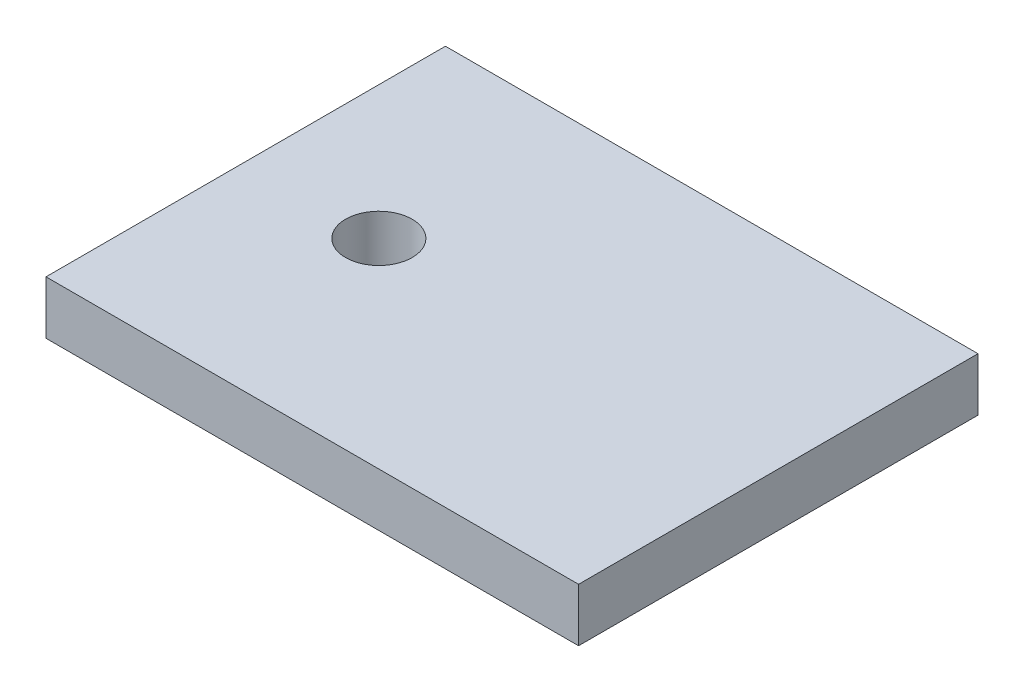
ISO-10303-21;
HEADER;
FILE_DESCRIPTION(('STEP AP214'),'2;1');
FILE_NAME('part.step','',(''),(''),'','','');
FILE_SCHEMA(('AUTOMOTIVE_DESIGN { 1 0 10303 214 1 1 1 1 }'));
ENDSEC;
DATA;
#1=APPLICATION_CONTEXT('core data for automotive mechanical design processes');
#2=APPLICATION_PROTOCOL_DEFINITION('international standard','automotive_design',2000,#1);
#3=PRODUCT_CONTEXT('',#1,'mechanical');
#4=PRODUCT('Part','Part','',(#3));
#5=PRODUCT_RELATED_PRODUCT_CATEGORY('part','',(#4));
#6=PRODUCT_DEFINITION_FORMATION('','',#4);
#7=PRODUCT_DEFINITION_CONTEXT('part definition',#1,'design');
#8=PRODUCT_DEFINITION('design','',#6,#7);
#9=PRODUCT_DEFINITION_SHAPE('','',#8);
#10=(LENGTH_UNIT() NAMED_UNIT(*) SI_UNIT(.MILLI.,.METRE.));
#11=(NAMED_UNIT(*) PLANE_ANGLE_UNIT() SI_UNIT($,.RADIAN.));
#12=(NAMED_UNIT(*) SI_UNIT($,.STERADIAN.) SOLID_ANGLE_UNIT());
#13=UNCERTAINTY_MEASURE_WITH_UNIT(LENGTH_MEASURE(1.E-05),#10,'distance_accuracy_value','');
#14=(GEOMETRIC_REPRESENTATION_CONTEXT(3) GLOBAL_UNCERTAINTY_ASSIGNED_CONTEXT((#13)) GLOBAL_UNIT_ASSIGNED_CONTEXT((#10,
#11,#12)) REPRESENTATION_CONTEXT('',''));
#15=CARTESIAN_POINT('',(0.,0.,0.));
#16=DIRECTION('',(0.,0.,1.));
#17=DIRECTION('',(1.,0.,0.));
#18=AXIS2_PLACEMENT_3D('',#15,#16,#17);
#19=CARTESIAN_POINT('',(20.,4.,15.));
#20=DIRECTION('',(-1.,0.,0.));
#21=DIRECTION('',(0.,0.,1.));
#22=AXIS2_PLACEMENT_3D('',#19,#20,#21);
#23=PLANE('',#22);
#24=DIRECTION('',(0.,0.,-1.));
#25=VECTOR('',#24,1.);
#26=CARTESIAN_POINT('',(20.,0.,15.));
#27=LINE('',#26,#25);
#28=CARTESIAN_POINT('',(20.,0.,15.));
#29=VERTEX_POINT('',#28);
#30=CARTESIAN_POINT('',(20.,0.,-15.));
#31=VERTEX_POINT('',#30);
#32=EDGE_CURVE('E111',#29,#31,#27,.T.);
#33=ORIENTED_EDGE('',*,*,#32,.T.);
#34=DIRECTION('',(0.,-1.,0.));
#35=VECTOR('',#34,1.);
#36=CARTESIAN_POINT('',(20.,4.,-15.));
#37=LINE('',#36,#35);
#38=CARTESIAN_POINT('',(20.,4.,-15.));
#39=VERTEX_POINT('',#38);
#40=EDGE_CURVE('E11',#39,#31,#37,.T.);
#41=ORIENTED_EDGE('',*,*,#40,.F.);
#42=DIRECTION('',(0.,0.,-1.));
#43=VECTOR('',#42,1.);
#44=CARTESIAN_POINT('',(20.,4.,15.));
#45=LINE('',#44,#43);
#46=CARTESIAN_POINT('',(20.,4.,15.));
#47=VERTEX_POINT('',#46);
#48=EDGE_CURVE('E95',#47,#39,#45,.T.);
#49=ORIENTED_EDGE('',*,*,#48,.F.);
#50=DIRECTION('',(0.,-1.,0.));
#51=VECTOR('',#50,1.);
#52=CARTESIAN_POINT('',(20.,4.,15.));
#53=LINE('',#52,#51);
#54=EDGE_CURVE('E107',#47,#29,#53,.T.);
#55=ORIENTED_EDGE('',*,*,#54,.T.);
#56=EDGE_LOOP('',(#33,#41,#49,#55));
#57=FACE_BOUND('',#56,.T.);
#58=ADVANCED_FACE('F43',(#57),#23,.F.);
#59=CARTESIAN_POINT('',(-20.,4.,-15.));
#60=DIRECTION('',(0.,0.,1.));
#61=DIRECTION('',(1.,0.,0.));
#62=AXIS2_PLACEMENT_3D('',#59,#60,#61);
#63=PLANE('',#62);
#64=DIRECTION('',(-1.,0.,0.));
#65=VECTOR('',#64,1.);
#66=CARTESIAN_POINT('',(-20.,0.,-15.));
#67=LINE('',#66,#65);
#68=CARTESIAN_POINT('',(-20.,0.,-15.));
#69=VERTEX_POINT('',#68);
#70=EDGE_CURVE('E100',#31,#69,#67,.T.);
#71=ORIENTED_EDGE('',*,*,#70,.T.);
#72=DIRECTION('',(0.,-1.,0.));
#73=VECTOR('',#72,1.);
#74=CARTESIAN_POINT('',(-20.,4.,-15.));
#75=LINE('',#74,#73);
#76=CARTESIAN_POINT('',(-20.,4.,-15.));
#77=VERTEX_POINT('',#76);
#78=EDGE_CURVE('E52',#77,#69,#75,.T.);
#79=ORIENTED_EDGE('',*,*,#78,.F.);
#80=DIRECTION('',(-1.,0.,0.));
#81=VECTOR('',#80,1.);
#82=CARTESIAN_POINT('',(-20.,4.,-15.));
#83=LINE('',#82,#81);
#84=EDGE_CURVE('E90',#39,#77,#83,.T.);
#85=ORIENTED_EDGE('',*,*,#84,.F.);
#86=ORIENTED_EDGE('',*,*,#40,.T.);
#87=EDGE_LOOP('',(#71,#79,#85,#86));
#88=FACE_BOUND('',#87,.T.);
#89=ADVANCED_FACE('F99',(#88),#63,.F.);
#90=CARTESIAN_POINT('',(-20.,4.,15.));
#91=DIRECTION('',(1.,0.,0.));
#92=DIRECTION('',(0.,0.,-1.));
#93=AXIS2_PLACEMENT_3D('',#90,#91,#92);
#94=PLANE('',#93);
#95=DIRECTION('',(0.,0.,1.));
#96=VECTOR('',#95,1.);
#97=CARTESIAN_POINT('',(-20.,0.,15.));
#98=LINE('',#97,#96);
#99=CARTESIAN_POINT('',(-20.,0.,15.));
#100=VERTEX_POINT('',#99);
#101=EDGE_CURVE('E77',#69,#100,#98,.T.);
#102=ORIENTED_EDGE('',*,*,#101,.T.);
#103=DIRECTION('',(0.,-1.,0.));
#104=VECTOR('',#103,1.);
#105=CARTESIAN_POINT('',(-20.,4.,15.));
#106=LINE('',#105,#104);
#107=CARTESIAN_POINT('',(-20.,4.,15.));
#108=VERTEX_POINT('',#107);
#109=EDGE_CURVE('E102',#108,#100,#106,.T.);
#110=ORIENTED_EDGE('',*,*,#109,.F.);
#111=DIRECTION('',(0.,0.,1.));
#112=VECTOR('',#111,1.);
#113=CARTESIAN_POINT('',(-20.,4.,15.));
#114=LINE('',#113,#112);
#115=EDGE_CURVE('E93',#77,#108,#114,.T.);
#116=ORIENTED_EDGE('',*,*,#115,.F.);
#117=ORIENTED_EDGE('',*,*,#78,.T.);
#118=EDGE_LOOP('',(#102,#110,#116,#117));
#119=FACE_BOUND('',#118,.T.);
#120=ADVANCED_FACE('F103',(#119),#94,.F.);
#121=CARTESIAN_POINT('',(-20.,4.,15.));
#122=DIRECTION('',(0.,0.,-1.));
#123=DIRECTION('',(-1.,0.,0.));
#124=AXIS2_PLACEMENT_3D('',#121,#122,#123);
#125=PLANE('',#124);
#126=DIRECTION('',(1.,0.,0.));
#127=VECTOR('',#126,1.);
#128=CARTESIAN_POINT('',(-20.,0.,15.));
#129=LINE('',#128,#127);
#130=EDGE_CURVE('E83',#100,#29,#129,.T.);
#131=ORIENTED_EDGE('',*,*,#130,.T.);
#132=ORIENTED_EDGE('',*,*,#54,.F.);
#133=DIRECTION('',(1.,0.,0.));
#134=VECTOR('',#133,1.);
#135=CARTESIAN_POINT('',(-20.,4.,15.));
#136=LINE('',#135,#134);
#137=EDGE_CURVE('E60',#108,#47,#136,.T.);
#138=ORIENTED_EDGE('',*,*,#137,.F.);
#139=ORIENTED_EDGE('',*,*,#109,.T.);
#140=EDGE_LOOP('',(#131,#132,#138,#139));
#141=FACE_BOUND('',#140,.T.);
#142=ADVANCED_FACE('F125',(#141),#125,.F.);
#143=CARTESIAN_POINT('',(0.,4.,0.));
#144=DIRECTION('',(0.,-1.,0.));
#145=DIRECTION('',(0.,0.,-1.));
#146=AXIS2_PLACEMENT_3D('',#143,#144,#145);
#147=PLANE('',#146);
#148=CARTESIAN_POINT('',(-10.,4.,0.));
#149=DIRECTION('',(0.,1.,0.));
#150=DIRECTION('',(0.,0.,1.));
#151=AXIS2_PLACEMENT_3D('',#148,#149,#150);
#152=CIRCLE('',#151,2.5);
#153=CARTESIAN_POINT('',(-10.,4.,2.5));
#154=VERTEX_POINT('',#153);
#155=EDGE_CURVE('E132',#154,#154,#152,.T.);
#156=ORIENTED_EDGE('',*,*,#155,.F.);
#157=EDGE_LOOP('',(#156));
#158=FACE_BOUND('',#157,.T.);
#159=ORIENTED_EDGE('',*,*,#48,.T.);
#160=ORIENTED_EDGE('',*,*,#84,.T.);
#161=ORIENTED_EDGE('',*,*,#115,.T.);
#162=ORIENTED_EDGE('',*,*,#137,.T.);
#163=EDGE_LOOP('',(#159,#160,#161,#162));
#164=FACE_BOUND('',#163,.T.);
#165=ADVANCED_FACE('F91',(#158,#164),#147,.F.);
#166=CARTESIAN_POINT('',(0.,0.,0.));
#167=DIRECTION('',(0.,-1.,0.));
#168=DIRECTION('',(0.,0.,-1.));
#169=AXIS2_PLACEMENT_3D('',#166,#167,#168);
#170=PLANE('',#169);
#171=CARTESIAN_POINT('',(-10.,0.,0.));
#172=DIRECTION('',(0.,1.,0.));
#173=DIRECTION('',(0.,0.,1.));
#174=AXIS2_PLACEMENT_3D('',#171,#172,#173);
#175=CIRCLE('',#174,2.5);
#176=CARTESIAN_POINT('',(-10.,0.,2.5));
#177=VERTEX_POINT('',#176);
#178=EDGE_CURVE('E115',#177,#177,#175,.T.);
#179=ORIENTED_EDGE('',*,*,#178,.T.);
#180=EDGE_LOOP('',(#179));
#181=FACE_BOUND('',#180,.T.);
#182=ORIENTED_EDGE('',*,*,#32,.F.);
#183=ORIENTED_EDGE('',*,*,#130,.F.);
#184=ORIENTED_EDGE('',*,*,#101,.F.);
#185=ORIENTED_EDGE('',*,*,#70,.F.);
#186=EDGE_LOOP('',(#182,#183,#184,#185));
#187=FACE_BOUND('',#186,.T.);
#188=ADVANCED_FACE('F128',(#181,#187),#170,.T.);
#189=CARTESIAN_POINT('',(-10.,0.,0.));
#190=DIRECTION('',(0.,1.,0.));
#191=DIRECTION('',(0.,0.,1.));
#192=AXIS2_PLACEMENT_3D('',#189,#190,#191);
#193=CYLINDRICAL_SURFACE('',#192,2.5);
#194=ORIENTED_EDGE('',*,*,#178,.F.);
#195=EDGE_LOOP('',(#194));
#196=FACE_BOUND('',#195,.T.);
#197=ORIENTED_EDGE('',*,*,#155,.T.);
#198=EDGE_LOOP('',(#197));
#199=FACE_BOUND('',#198,.T.);
#200=ADVANCED_FACE('F141',(#196,#199),#193,.F.);
#201=CLOSED_SHELL('',(#58,#89,#120,#142,#165,#188,#200));
#202=MANIFOLD_SOLID_BREP('B2',#201);
#203=ADVANCED_BREP_SHAPE_REPRESENTATION('',(#18,#202),#14);
#204=SHAPE_DEFINITION_REPRESENTATION(#9,#203);
ENDSEC;
END-ISO-10303-21;
